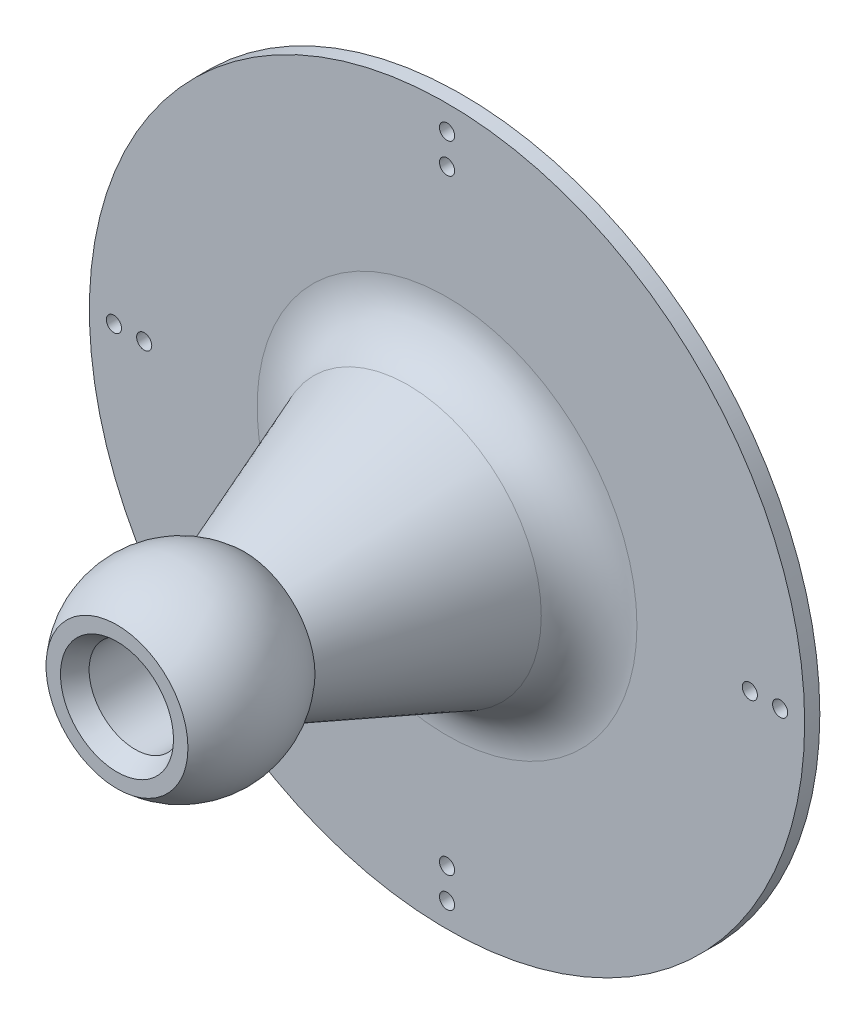
ISO-10303-21;
HEADER;
FILE_DESCRIPTION(('STEP AP214'),'2;1');
FILE_NAME('part.step','',(''),(''),'','','');
FILE_SCHEMA(('AUTOMOTIVE_DESIGN { 1 0 10303 214 1 1 1 1 }'));
ENDSEC;
DATA;
#1=APPLICATION_CONTEXT('core data for automotive mechanical design processes');
#2=APPLICATION_PROTOCOL_DEFINITION('international standard','automotive_design',2000,#1);
#3=PRODUCT_CONTEXT('',#1,'mechanical');
#4=PRODUCT('Part','Part','',(#3));
#5=PRODUCT_RELATED_PRODUCT_CATEGORY('part','',(#4));
#6=PRODUCT_DEFINITION_FORMATION('','',#4);
#7=PRODUCT_DEFINITION_CONTEXT('part definition',#1,'design');
#8=PRODUCT_DEFINITION('design','',#6,#7);
#9=PRODUCT_DEFINITION_SHAPE('','',#8);
#10=(LENGTH_UNIT() NAMED_UNIT(*) SI_UNIT(.MILLI.,.METRE.));
#11=(NAMED_UNIT(*) PLANE_ANGLE_UNIT() SI_UNIT($,.RADIAN.));
#12=(NAMED_UNIT(*) SI_UNIT($,.STERADIAN.) SOLID_ANGLE_UNIT());
#13=UNCERTAINTY_MEASURE_WITH_UNIT(LENGTH_MEASURE(1.E-05),#10,'distance_accuracy_value','');
#14=(GEOMETRIC_REPRESENTATION_CONTEXT(3) GLOBAL_UNCERTAINTY_ASSIGNED_CONTEXT((#13)) GLOBAL_UNIT_ASSIGNED_CONTEXT((#10,
#11,#12)) REPRESENTATION_CONTEXT('',''));
#15=CARTESIAN_POINT('',(0.,0.,0.));
#16=DIRECTION('',(0.,0.,1.));
#17=DIRECTION('',(1.,0.,0.));
#18=AXIS2_PLACEMENT_3D('',#15,#16,#17);
#19=CARTESIAN_POINT('',(0.,0.,-1.29374463449351));
#20=DIRECTION('',(0.,0.,1.));
#21=DIRECTION('',(1.,0.,0.));
#22=AXIS2_PLACEMENT_3D('',#19,#20,#21);
#23=CYLINDRICAL_SURFACE('',#22,75.);
#24=CARTESIAN_POINT('',(0.,0.,-1.29374463449352));
#25=DIRECTION('',(0.,0.,1.));
#26=DIRECTION('',(1.,0.,0.));
#27=AXIS2_PLACEMENT_3D('',#24,#25,#26);
#28=CIRCLE('',#27,75.);
#29=CARTESIAN_POINT('',(75.,0.,-1.29374463449351));
#30=VERTEX_POINT('',#29);
#31=EDGE_CURVE('E73',#30,#30,#28,.T.);
#32=ORIENTED_EDGE('',*,*,#31,.T.);
#33=EDGE_LOOP('',(#32));
#34=FACE_BOUND('',#33,.T.);
#35=CARTESIAN_POINT('',(0.,0.,1.88125536550682));
#36=DIRECTION('',(0.,0.,1.));
#37=DIRECTION('',(1.,0.,0.));
#38=AXIS2_PLACEMENT_3D('',#35,#36,#37);
#39=CIRCLE('',#38,75.);
#40=CARTESIAN_POINT('',(75.,0.,1.88125536550683));
#41=VERTEX_POINT('',#40);
#42=EDGE_CURVE('E61',#41,#41,#39,.T.);
#43=ORIENTED_EDGE('',*,*,#42,.F.);
#44=EDGE_LOOP('',(#43));
#45=FACE_BOUND('',#44,.T.);
#46=ADVANCED_FACE('F35',(#34,#45),#23,.T.);
#47=CARTESIAN_POINT('',(31.0649005738103,0.,1.88125536550682));
#48=DIRECTION('',(0.,0.,1.));
#49=DIRECTION('',(1.,0.,0.));
#50=AXIS2_PLACEMENT_3D('',#47,#48,#49);
#51=PLANE('',#50);
#52=CARTESIAN_POINT('',(0.,0.,1.88125536550682));
#53=DIRECTION('',(0.,0.,1.));
#54=DIRECTION('',(1.,0.,0.));
#55=AXIS2_PLACEMENT_3D('',#52,#53,#54);
#56=CIRCLE('',#55,39.8233826032935);
#57=CARTESIAN_POINT('',(39.8233826032935,0.,1.88125536550682));
#58=VERTEX_POINT('',#57);
#59=EDGE_CURVE('E10',#58,#58,#56,.F.);
#60=ORIENTED_EDGE('',*,*,#59,.T.);
#61=EDGE_LOOP('',(#60));
#62=FACE_BOUND('',#61,.T.);
#63=CARTESIAN_POINT('',(63.5,0.,1.88125536550683));
#64=DIRECTION('',(0.,0.,1.));
#65=DIRECTION('',(1.,0.,0.));
#66=AXIS2_PLACEMENT_3D('',#63,#64,#65);
#67=CIRCLE('',#66,1.58750000000001);
#68=CARTESIAN_POINT('',(65.0875,0.,1.88125536550683));
#69=VERTEX_POINT('',#68);
#70=EDGE_CURVE('E121',#69,#69,#67,.T.);
#71=ORIENTED_EDGE('',*,*,#70,.F.);
#72=EDGE_LOOP('',(#71));
#73=FACE_BOUND('',#72,.T.);
#74=CARTESIAN_POINT('',(69.85,0.,1.88125536550683));
#75=DIRECTION('',(0.,0.,1.));
#76=DIRECTION('',(1.,0.,0.));
#77=AXIS2_PLACEMENT_3D('',#74,#75,#76);
#78=CIRCLE('',#77,1.58750000000001);
#79=CARTESIAN_POINT('',(71.4375,0.,1.88125536550683));
#80=VERTEX_POINT('',#79);
#81=EDGE_CURVE('E115',#80,#80,#78,.T.);
#82=ORIENTED_EDGE('',*,*,#81,.F.);
#83=EDGE_LOOP('',(#82));
#84=FACE_BOUND('',#83,.T.);
#85=CARTESIAN_POINT('',(0.,63.5,1.88125536550682));
#86=DIRECTION('',(0.,0.,1.));
#87=DIRECTION('',(1.,0.,0.));
#88=AXIS2_PLACEMENT_3D('',#85,#86,#87);
#89=CIRCLE('',#88,1.58750000000001);
#90=CARTESIAN_POINT('',(1.5875,63.5,1.88125536550682));
#91=VERTEX_POINT('',#90);
#92=EDGE_CURVE('E109',#91,#91,#89,.T.);
#93=ORIENTED_EDGE('',*,*,#92,.F.);
#94=EDGE_LOOP('',(#93));
#95=FACE_BOUND('',#94,.T.);
#96=CARTESIAN_POINT('',(0.,69.85,1.88125536550682));
#97=DIRECTION('',(0.,0.,1.));
#98=DIRECTION('',(1.,0.,0.));
#99=AXIS2_PLACEMENT_3D('',#96,#97,#98);
#100=CIRCLE('',#99,1.58750000000001);
#101=CARTESIAN_POINT('',(1.5875,69.85,1.88125536550682));
#102=VERTEX_POINT('',#101);
#103=EDGE_CURVE('E103',#102,#102,#100,.T.);
#104=ORIENTED_EDGE('',*,*,#103,.F.);
#105=EDGE_LOOP('',(#104));
#106=FACE_BOUND('',#105,.T.);
#107=CARTESIAN_POINT('',(-63.5,0.,1.88125536550681));
#108=DIRECTION('',(0.,0.,1.));
#109=DIRECTION('',(1.,0.,0.));
#110=AXIS2_PLACEMENT_3D('',#107,#108,#109);
#111=CIRCLE('',#110,1.58750000000001);
#112=CARTESIAN_POINT('',(-61.9125,0.,1.88125536550681));
#113=VERTEX_POINT('',#112);
#114=EDGE_CURVE('E97',#113,#113,#111,.T.);
#115=ORIENTED_EDGE('',*,*,#114,.F.);
#116=EDGE_LOOP('',(#115));
#117=FACE_BOUND('',#116,.T.);
#118=CARTESIAN_POINT('',(-69.85,0.,1.88125536550681));
#119=DIRECTION('',(0.,0.,1.));
#120=DIRECTION('',(1.,0.,0.));
#121=AXIS2_PLACEMENT_3D('',#118,#119,#120);
#122=CIRCLE('',#121,1.58750000000001);
#123=CARTESIAN_POINT('',(-68.2625,0.,1.88125536550681));
#124=VERTEX_POINT('',#123);
#125=EDGE_CURVE('E91',#124,#124,#122,.T.);
#126=ORIENTED_EDGE('',*,*,#125,.F.);
#127=EDGE_LOOP('',(#126));
#128=FACE_BOUND('',#127,.T.);
#129=CARTESIAN_POINT('',(0.,-63.5,1.88125536550682));
#130=DIRECTION('',(0.,0.,1.));
#131=DIRECTION('',(1.,0.,0.));
#132=AXIS2_PLACEMENT_3D('',#129,#130,#131);
#133=CIRCLE('',#132,1.58750000000001);
#134=CARTESIAN_POINT('',(1.58750000000001,-63.5,1.88125536550682));
#135=VERTEX_POINT('',#134);
#136=EDGE_CURVE('E85',#135,#135,#133,.T.);
#137=ORIENTED_EDGE('',*,*,#136,.F.);
#138=EDGE_LOOP('',(#137));
#139=FACE_BOUND('',#138,.T.);
#140=CARTESIAN_POINT('',(0.,-69.85,1.88125536550682));
#141=DIRECTION('',(0.,0.,1.));
#142=DIRECTION('',(1.,0.,0.));
#143=AXIS2_PLACEMENT_3D('',#140,#141,#142);
#144=CIRCLE('',#143,1.58750000000001);
#145=CARTESIAN_POINT('',(1.58750000000001,-69.85,1.88125536550682));
#146=VERTEX_POINT('',#145);
#147=EDGE_CURVE('E79',#146,#146,#144,.T.);
#148=ORIENTED_EDGE('',*,*,#147,.F.);
#149=EDGE_LOOP('',(#148));
#150=FACE_BOUND('',#149,.T.);
#151=ORIENTED_EDGE('',*,*,#42,.T.);
#152=EDGE_LOOP('',(#151));
#153=FACE_BOUND('',#152,.T.);
#154=ADVANCED_FACE('F155',(#62,#73,#84,#95,#106,#117,#128,#139,#150,#153),#51,.T.);
#155=CARTESIAN_POINT('',(0.,0.,44.45));
#156=DIRECTION('',(0.,0.,-1.));
#157=DIRECTION('',(-1.,0.,0.));
#158=AXIS2_PLACEMENT_3D('',#155,#156,#157);
#159=CONICAL_SURFACE('',#158,14.8807171904986,0.363312458048292);
#160=CARTESIAN_POINT('',(0.,0.,10.0680257085899));
#161=DIRECTION('',(0.,0.,-1.));
#162=DIRECTION('',(-1.,0.,0.));
#163=AXIS2_PLACEMENT_3D('',#160,#161,#162);
#164=CIRCLE('',#163,27.9523776726262);
#165=CARTESIAN_POINT('',(-27.9523776726262,0.,10.0680257085899));
#166=VERTEX_POINT('',#165);
#167=EDGE_CURVE('E42',#166,#166,#164,.F.);
#168=ORIENTED_EDGE('',*,*,#167,.T.);
#169=EDGE_LOOP('',(#168));
#170=FACE_BOUND('',#169,.T.);
#171=CARTESIAN_POINT('',(0.,0.,44.45));
#172=DIRECTION('',(0.,0.,1.));
#173=DIRECTION('',(1.,0.,0.));
#174=AXIS2_PLACEMENT_3D('',#171,#172,#173);
#175=CIRCLE('',#174,14.8807171904986);
#176=CARTESIAN_POINT('',(14.8807171904986,0.,44.45));
#177=VERTEX_POINT('',#176);
#178=EDGE_CURVE('E64',#177,#177,#175,.T.);
#179=ORIENTED_EDGE('',*,*,#178,.F.);
#180=EDGE_LOOP('',(#179));
#181=FACE_BOUND('',#180,.T.);
#182=ADVANCED_FACE('F160',(#170,#181),#159,.T.);
#183=CARTESIAN_POINT('',(-1.50747470062384E-12,0.,57.768975615972));
#184=DIRECTION('',(0.,0.,1.));
#185=DIRECTION('',(1.,0.,0.));
#186=AXIS2_PLACEMENT_3D('',#183,#184,#185);
#187=SPHERICAL_SURFACE('',#186,19.9707500000001);
#188=CARTESIAN_POINT('',(0.,0.,71.0879512319442));
#189=DIRECTION('',(0.,0.,1.));
#190=DIRECTION('',(1.,0.,0.));
#191=AXIS2_PLACEMENT_3D('',#188,#189,#190);
#192=CIRCLE('',#191,14.8807171904985);
#193=CARTESIAN_POINT('',(14.8807171904984,0.,71.0879512319442));
#194=VERTEX_POINT('',#193);
#195=EDGE_CURVE('E67',#194,#194,#192,.T.);
#196=CARTESIAN_POINT('',(14.8807171904986,0.,44.45));
#197=CARTESIAN_POINT('',(15.083300924023,0.,44.6763303094797));
#198=CARTESIAN_POINT('',(15.2807130555634,0.,44.9072889083303));
#199=CARTESIAN_POINT('',(15.6648007895345,0.,45.3779675146893));
#200=CARTESIAN_POINT('',(15.8514763919652,0.,45.6176875221975));
#201=CARTESIAN_POINT('',(16.2136977425753,0.,46.105393775787));
#202=CARTESIAN_POINT('',(16.3892434907546,0.,46.3533800218682));
#203=CARTESIAN_POINT('',(16.7288409654187,0.,46.8571014877006));
#204=CARTESIAN_POINT('',(16.8928926919034,0.,47.1128367074517));
#205=CARTESIAN_POINT('',(17.2091602781304,0.,47.6315240341799));
#206=CARTESIAN_POINT('',(17.3613761378726,0.,47.8944761411569));
#207=CARTESIAN_POINT('',(17.6536552142219,0.,48.4270497816502));
#208=CARTESIAN_POINT('',(17.7937184308291,0.,48.6966713151666));
#209=CARTESIAN_POINT('',(18.0614006274231,0.,49.2420225583447));
#210=CARTESIAN_POINT('',(18.18901960741,0.,49.5177522680065));
#211=CARTESIAN_POINT('',(18.4315476732751,0.,50.0747458725197));
#212=CARTESIAN_POINT('',(18.5464567591533,0.,50.3560097673712));
#213=CARTESIAN_POINT('',(18.763325829186,0.,50.9234862375631));
#214=CARTESIAN_POINT('',(18.8652858133404,0.,51.2096988129035));
#215=CARTESIAN_POINT('',(19.0560444306293,0.,51.7864768359117));
#216=CARTESIAN_POINT('',(19.1448430637638,0.,52.0770422835796));
#217=CARTESIAN_POINT('',(19.3090941270641,0.,52.6619211822061));
#218=CARTESIAN_POINT('',(19.3845465572298,0.,52.9562346331646));
#219=CARTESIAN_POINT('',(19.5219481455499,0.,53.5479968669995));
#220=CARTESIAN_POINT('',(19.5838973037041,0.,53.8454456498759));
#221=CARTESIAN_POINT('',(19.6941633886329,0.,54.4428593493982));
#222=CARTESIAN_POINT('',(19.7424803154073,0.,54.7428242660442));
#223=CARTESIAN_POINT('',(19.8253813563909,0.,55.3446457971208));
#224=CARTESIAN_POINT('',(19.8599654706,0.,55.6465024115515));
#225=CARTESIAN_POINT('',(19.9153288928151,0.,56.2514789642739));
#226=CARTESIAN_POINT('',(19.9361082008211,0.,56.5545989025656));
#227=CARTESIAN_POINT('',(19.9638187544128,0.,57.161471099229));
#228=CARTESIAN_POINT('',(19.9707499999985,0.,57.4652233576006));
#229=CARTESIAN_POINT('',(19.9707499999985,0.,58.0727278743437));
#230=CARTESIAN_POINT('',(19.9638187544128,0.,58.3764801327153));
#231=CARTESIAN_POINT('',(19.936108200821,0.,58.9833523293786));
#232=CARTESIAN_POINT('',(19.915328892815,0.,59.2864722676703));
#233=CARTESIAN_POINT('',(19.8599654705999,0.,59.8914488203928));
#234=CARTESIAN_POINT('',(19.8253813563908,0.,60.1933054348234));
#235=CARTESIAN_POINT('',(19.7424803154073,0.,60.7951269659));
#236=CARTESIAN_POINT('',(19.6941633886328,0.,61.095091882546));
#237=CARTESIAN_POINT('',(19.5838973037041,0.,61.6925055820683));
#238=CARTESIAN_POINT('',(19.5219481455498,0.,61.9899543649447));
#239=CARTESIAN_POINT('',(19.3845465572298,0.,62.5817165987796));
#240=CARTESIAN_POINT('',(19.309094127064,0.,62.8760300497382));
#241=CARTESIAN_POINT('',(19.1448430637638,0.,63.4609089483646));
#242=CARTESIAN_POINT('',(19.0560444306293,0.,63.7514743960325));
#243=CARTESIAN_POINT('',(18.8652858133403,0.,64.3282524190408));
#244=CARTESIAN_POINT('',(18.7633258291859,0.,64.6144649943811));
#245=CARTESIAN_POINT('',(18.5464567591532,0.,65.181941464573));
#246=CARTESIAN_POINT('',(18.431547673275,0.,65.4632053594245));
#247=CARTESIAN_POINT('',(18.1890196074099,0.,66.0201989639377));
#248=CARTESIAN_POINT('',(18.061400627423,0.,66.2959286735995));
#249=CARTESIAN_POINT('',(17.793718430829,0.,66.8412799167776));
#250=CARTESIAN_POINT('',(17.6536552142218,0.,67.110901450294));
#251=CARTESIAN_POINT('',(17.3613761378724,0.,67.6434750907873));
#252=CARTESIAN_POINT('',(17.2091602781303,0.,67.9064271977643));
#253=CARTESIAN_POINT('',(16.8928926919033,0.,68.4251145244925));
#254=CARTESIAN_POINT('',(16.7288409654186,0.,68.6808497442436));
#255=CARTESIAN_POINT('',(16.3892434907545,0.,69.184571210076));
#256=CARTESIAN_POINT('',(16.2136977425751,0.,69.4325574561572));
#257=CARTESIAN_POINT('',(15.8514763919651,0.,69.9202637097467));
#258=CARTESIAN_POINT('',(15.6648007895344,0.,70.1599837172549));
#259=CARTESIAN_POINT('',(15.2807130555632,0.,70.6306623236138));
#260=CARTESIAN_POINT('',(15.0833009240228,0.,70.8616209224645));
#261=CARTESIAN_POINT('',(14.8807171904984,0.,71.0879512319442));
#262=B_SPLINE_CURVE_WITH_KNOTS('',3,(#196,#197,#198,#199,#200,#201,#202,#203,#204,#205,#206,
#207,#208,#209,#210,#211,#212,#213,#214,#215,#216,#217,#218,#219,#220,#221,#222,#223,#224,#225,
#226,#227,#228,#229,#230,#231,#232,#233,#234,#235,#236,#237,#238,#239,#240,#241,#242,#243,#244,
#245,#246,#247,#248,#249,#250,#251,#252,#253,#254,#255,#256,#257,#258,#259,#260,#261),
.UNSPECIFIED.,.F.,.F.,(4,2,2,2,2,2,2,2,2,2,2,2,2,2,2,2,2,2,2,2,2,2,2,2,2,2,2,2,2,2,2,2,4),(0.,
0.911177745396351,1.8223554907927,2.73353323618905,3.6447109815854,4.55588872698175,
5.4670664723781,6.37824421777446,7.28942196317081,8.20059970856716,9.11177745396351,
10.0229551993599,10.9341329447562,11.8453106901526,12.7564884355489,13.6676661809453,
14.5788439263416,15.490021671738,16.4011994171343,17.3123771625307,18.223554907927,
19.1347326533234,20.0459103987197,20.9570881441161,21.8682658895124,22.7794436349088,
23.6906213803051,24.6017991257015,25.5129768710978,26.4241546164942,27.3353323618905,
28.2465101072869,29.1576878526832),.UNSPECIFIED.);
#263=EDGE_CURVE('BSEAM165',#177,#194,#262,.T.);
#264=ORIENTED_EDGE('',*,*,#178,.T.);
#265=ORIENTED_EDGE('',*,*,#195,.F.);
#266=ORIENTED_EDGE('',*,*,#263,.T.);
#267=ORIENTED_EDGE('',*,*,#263,.F.);
#268=EDGE_LOOP('',(#264,#266,#265,#267));
#269=FACE_BOUND('',#268,.T.);
#270=ADVANCED_FACE('F165',(#269),#187,.T.);
#271=CARTESIAN_POINT('',(9.65199999999867,0.,71.0879512319442));
#272=DIRECTION('',(0.,0.,1.));
#273=DIRECTION('',(1.,0.,0.));
#274=AXIS2_PLACEMENT_3D('',#271,#272,#273);
#275=PLANE('',#274);
#276=CARTESIAN_POINT('',(0.,0.,71.0879512319442));
#277=DIRECTION('',(0.,0.,1.));
#278=DIRECTION('',(1.,0.,0.));
#279=AXIS2_PLACEMENT_3D('',#276,#277,#278);
#280=CIRCLE('',#279,11.8517045256111);
#281=CARTESIAN_POINT('',(11.8517045256111,0.,71.0879512319442));
#282=VERTEX_POINT('',#281);
#283=EDGE_CURVE('E55',#282,#282,#280,.F.);
#284=ORIENTED_EDGE('',*,*,#283,.T.);
#285=EDGE_LOOP('',(#284));
#286=FACE_BOUND('',#285,.T.);
#287=ORIENTED_EDGE('',*,*,#195,.T.);
#288=EDGE_LOOP('',(#287));
#289=FACE_BOUND('',#288,.T.);
#290=ADVANCED_FACE('F197',(#286,#289),#275,.T.);
#291=CARTESIAN_POINT('',(0.,0.,-1.29374463449351));
#292=DIRECTION('',(0.,0.,1.));
#293=DIRECTION('',(1.,0.,0.));
#294=AXIS2_PLACEMENT_3D('',#291,#292,#293);
#295=CYLINDRICAL_SURFACE('',#294,9.65199999999866);
#296=CARTESIAN_POINT('',(0.,0.,67.2779512319443));
#297=DIRECTION('',(0.,0.,1.));
#298=DIRECTION('',(1.,0.,0.));
#299=AXIS2_PLACEMENT_3D('',#296,#297,#298);
#300=CIRCLE('',#299,9.65199999999866);
#301=CARTESIAN_POINT('',(9.65199999999865,0.,67.2779512319443));
#302=VERTEX_POINT('',#301);
#303=EDGE_CURVE('E58',#302,#302,#300,.T.);
#304=ORIENTED_EDGE('',*,*,#303,.T.);
#305=EDGE_LOOP('',(#304));
#306=FACE_BOUND('',#305,.T.);
#307=CARTESIAN_POINT('',(0.,0.,22.7279363428212));
#308=DIRECTION('',(0.,0.,1.));
#309=DIRECTION('',(1.,0.,0.));
#310=AXIS2_PLACEMENT_3D('',#307,#308,#309);
#311=CIRCLE('',#310,9.65199999999864);
#312=CARTESIAN_POINT('',(9.65199999999863,0.,22.7279363428212));
#313=VERTEX_POINT('',#312);
#314=EDGE_CURVE('E70',#313,#313,#311,.T.);
#315=ORIENTED_EDGE('',*,*,#314,.F.);
#316=EDGE_LOOP('',(#315));
#317=FACE_BOUND('',#316,.T.);
#318=ADVANCED_FACE('F191',(#306,#317),#295,.F.);
#319=CARTESIAN_POINT('',(0.,0.,5.02040121775));
#320=DIRECTION('',(0.,0.,1.));
#321=DIRECTION('',(1.,0.,0.));
#322=AXIS2_PLACEMENT_3D('',#319,#320,#321);
#323=SPHERICAL_SURFACE('',#322,20.1672483052499);
#324=CARTESIAN_POINT('',(0.,0.,2.60685252921898));
#325=DIRECTION('',(0.,0.,1.));
#326=DIRECTION('',(1.,0.,0.));
#327=AXIS2_PLACEMENT_3D('',#324,#325,#326);
#328=CIRCLE('',#327,20.0223047358113);
#329=CARTESIAN_POINT('',(20.0223047358114,0.,2.60685252921899));
#330=VERTEX_POINT('',#329);
#331=EDGE_CURVE('E76',#330,#330,#328,.F.);
#332=CARTESIAN_POINT('',(9.65199999999863,0.,22.7279363428212));
#333=CARTESIAN_POINT('',(9.8718150562456,0.,22.6081224828854));
#334=CARTESIAN_POINT('',(10.0893967846654,0.,22.484211678121));
#335=CARTESIAN_POINT('',(10.5197970719614,0.,22.2283767714048));
#336=CARTESIAN_POINT('',(10.7326156308377,0.,22.0964526694531));
#337=CARTESIAN_POINT('',(11.1531930651572,0.,21.8247717608323));
#338=CARTESIAN_POINT('',(11.3609519406006,0.,21.6850149541632));
#339=CARTESIAN_POINT('',(11.7711222803323,0.,21.3978630677716));
#340=CARTESIAN_POINT('',(11.9735337446206,0.,21.250467988049));
#341=CARTESIAN_POINT('',(12.3727284754114,0.,20.9482437814837));
#342=CARTESIAN_POINT('',(12.5695117419138,0.,20.793414654641));
#343=CARTESIAN_POINT('',(12.9571772222608,0.,20.4765371024256));
#344=CARTESIAN_POINT('',(13.1480594361053,0.,20.314488677053));
#345=CARTESIAN_POINT('',(13.5236581052768,0.,19.9833972301756));
#346=CARTESIAN_POINT('',(13.7083745606039,0.,19.8143542086707));
#347=CARTESIAN_POINT('',(14.071385566136,0.,19.4695079867657));
#348=CARTESIAN_POINT('',(14.249680116341,0.,19.2937047863654));
#349=CARTESIAN_POINT('',(14.5996000679128,0.,18.935581994215));
#350=CARTESIAN_POINT('',(14.7712254692796,0.,18.7532624024649));
#351=CARTESIAN_POINT('',(15.107569128303,0.,18.3823596526208));
#352=CARTESIAN_POINT('',(15.2722873859596,0.,18.1937764945268));
#353=CARTESIAN_POINT('',(15.5945883407342,0.,17.8106081224685));
#354=CARTESIAN_POINT('',(15.7521710378523,0.,17.6160229085041));
#355=CARTESIAN_POINT('',(16.0599823497366,0.,17.2211202583808));
#356=CARTESIAN_POINT('',(16.2102109645027,0.,17.0208028222218));
#357=CARTESIAN_POINT('',(16.5031057878514,0.,16.6147135103054));
#358=CARTESIAN_POINT('',(16.645771996434,0.,16.408941634548));
#359=CARTESIAN_POINT('',(16.9233441704671,0.,15.9922287897736));
#360=CARTESIAN_POINT('',(17.0582501359177,0.,15.7812878207566));
#361=CARTESIAN_POINT('',(17.3201147479601,0.,15.3545293038441));
#362=CARTESIAN_POINT('',(17.4470733945519,0.,15.1387117559487));
#363=CARTESIAN_POINT('',(17.6928673137929,0.,14.7024993580717));
#364=CARTESIAN_POINT('',(17.8117025864422,0.,14.4821045080902));
#365=CARTESIAN_POINT('',(18.0410849674946,0.,14.037043130233));
#366=CARTESIAN_POINT('',(18.1516320758978,0.,13.8123766023573));
#367=CARTESIAN_POINT('',(18.3642848314521,0.,13.3590834164912));
#368=CARTESIAN_POINT('',(18.4663904786031,0.,13.1304567585008));
#369=CARTESIAN_POINT('',(18.6620187205225,0.,12.6695603517444));
#370=CARTESIAN_POINT('',(18.755541315291,0.,12.4372906029785));
#371=CARTESIAN_POINT('',(18.9338737635374,0.,11.9694301059284));
#372=CARTESIAN_POINT('',(19.0186836170154,0.,11.7338393576443));
#373=CARTESIAN_POINT('',(19.1794729758346,0.,11.259663558085));
#374=CARTESIAN_POINT('',(19.2554524811759,0.,11.0210785068099));
#375=CARTESIAN_POINT('',(19.3984757820319,0.,10.5412449500315));
#376=CARTESIAN_POINT('',(19.4655195775467,0.,10.2999964445283));
#377=CARTESIAN_POINT('',(19.5905784882919,0.,9.81517052150259));
#378=CARTESIAN_POINT('',(19.6485936035224,0.,9.57159310398012));
#379=CARTESIAN_POINT('',(19.7555147035127,0.,9.08244712864756));
#380=CARTESIAN_POINT('',(19.8044206882724,0.,8.83687857083748));
#381=CARTESIAN_POINT('',(19.8930557085332,0.,8.3440908478279));
#382=CARTESIAN_POINT('',(19.9327847440343,0.,8.09687168262842));
#383=CARTESIAN_POINT('',(20.0030107740535,0.,7.60112556654947));
#384=CARTESIAN_POINT('',(20.0335077685716,0.,7.35259861567001));
#385=CARTESIAN_POINT('',(20.0852274223151,0.,6.85458156385802));
#386=CARTESIAN_POINT('',(20.1064500815404,0.,6.60509146292549));
#387=CARTESIAN_POINT('',(20.139591649015,0.,6.10549408077068));
#388=CARTESIAN_POINT('',(20.1515105572642,0.,5.85538679954841));
#389=CARTESIAN_POINT('',(20.1660280423185,0.,5.35490188793483));
#390=CARTESIAN_POINT('',(20.1686266191237,0.,5.10452425754353));
#391=CARTESIAN_POINT('',(20.1645000332757,0.,4.60384583306019));
#392=CARTESIAN_POINT('',(20.1577748706226,0.,4.35354503896815));
#393=CARTESIAN_POINT('',(20.1350094022422,0.,3.85336744269131));
#394=CARTESIAN_POINT('',(20.118969096515,0.,3.6034906405065));
#395=CARTESIAN_POINT('',(20.0775983077276,0.,3.10450730948823));
#396=CARTESIAN_POINT('',(20.0522678246674,0.,2.85540078065475));
#397=CARTESIAN_POINT('',(20.0223047358114,0.,2.60685252921899));
#398=B_SPLINE_CURVE_WITH_KNOTS('',3,(#332,#333,#334,#335,#336,#337,#338,#339,#340,#341,#342,
#343,#344,#345,#346,#347,#348,#349,#350,#351,#352,#353,#354,#355,#356,#357,#358,#359,#360,#361,
#362,#363,#364,#365,#366,#367,#368,#369,#370,#371,#372,#373,#374,#375,#376,#377,#378,#379,#380,
#381,#382,#383,#384,#385,#386,#387,#388,#389,#390,#391,#392,#393,#394,#395,#396,#397),
.UNSPECIFIED.,.F.,.F.,(4,2,2,2,2,2,2,2,2,2,2,2,2,2,2,2,2,2,2,2,2,2,2,2,2,2,2,2,2,2,2,2,4),(0.,
0.750999743515791,1.50199948703159,2.25299923054738,3.00399897406317,3.75499871757896,
4.50599846109475,5.25699820461055,6.00799794812634,6.75899769164213,7.50999743515793,
8.26099717867372,9.01199692218951,9.7629966657053,10.5139964092211,11.2649961527369,
12.0159958962527,12.7669956397685,13.5179953832843,14.2689951268001,15.0199948703158,
15.7709946138316,16.5219943573474,17.2729941008632,18.023993844379,18.7749935878948,
19.5259933314106,20.2769930749264,21.0279928184422,21.778992561958,22.5299923054738,
23.2809920489896,24.0319917925054),.UNSPECIFIED.);
#399=EDGE_CURVE('BSEAM134',#313,#330,#398,.T.);
#400=ORIENTED_EDGE('',*,*,#314,.T.);
#401=ORIENTED_EDGE('',*,*,#331,.T.);
#402=ORIENTED_EDGE('',*,*,#399,.T.);
#403=ORIENTED_EDGE('',*,*,#399,.F.);
#404=EDGE_LOOP('',(#400,#402,#401,#403));
#405=FACE_BOUND('',#404,.T.);
#406=ADVANCED_FACE('F134',(#405),#323,.F.);
#407=CARTESIAN_POINT('',(75.,0.,-1.29374463449351));
#408=DIRECTION('',(0.,0.,-1.));
#409=DIRECTION('',(-1.,0.,0.));
#410=AXIS2_PLACEMENT_3D('',#407,#408,#409);
#411=PLANE('',#410);
#412=CARTESIAN_POINT('',(0.,0.,-1.29374463449352));
#413=DIRECTION('',(0.,0.,-1.));
#414=DIRECTION('',(-1.,0.,0.));
#415=AXIS2_PLACEMENT_3D('',#412,#413,#414);
#416=CIRCLE('',#415,31.3050417818289);
#417=CARTESIAN_POINT('',(-31.3050417818289,0.,-1.29374463449352));
#418=VERTEX_POINT('',#417);
#419=EDGE_CURVE('E46',#418,#418,#416,.F.);
#420=ORIENTED_EDGE('',*,*,#419,.T.);
#421=EDGE_LOOP('',(#420));
#422=FACE_BOUND('',#421,.T.);
#423=CARTESIAN_POINT('',(63.5,0.,-1.29374463449351));
#424=DIRECTION('',(0.,0.,-1.));
#425=DIRECTION('',(-1.,0.,0.));
#426=AXIS2_PLACEMENT_3D('',#423,#424,#425);
#427=CIRCLE('',#426,1.58750000000002);
#428=CARTESIAN_POINT('',(61.9125,0.,-1.29374463449351));
#429=VERTEX_POINT('',#428);
#430=EDGE_CURVE('E124',#429,#429,#427,.T.);
#431=ORIENTED_EDGE('',*,*,#430,.F.);
#432=EDGE_LOOP('',(#431));
#433=FACE_BOUND('',#432,.T.);
#434=CARTESIAN_POINT('',(69.85,0.,-1.29374463449351));
#435=DIRECTION('',(0.,0.,-1.));
#436=DIRECTION('',(-1.,0.,0.));
#437=AXIS2_PLACEMENT_3D('',#434,#435,#436);
#438=CIRCLE('',#437,1.58750000000002);
#439=CARTESIAN_POINT('',(68.2625,0.,-1.29374463449351));
#440=VERTEX_POINT('',#439);
#441=EDGE_CURVE('E118',#440,#440,#438,.T.);
#442=ORIENTED_EDGE('',*,*,#441,.F.);
#443=EDGE_LOOP('',(#442));
#444=FACE_BOUND('',#443,.T.);
#445=CARTESIAN_POINT('',(0.,63.5,-1.29374463449352));
#446=DIRECTION('',(0.,0.,-1.));
#447=DIRECTION('',(-1.,0.,0.));
#448=AXIS2_PLACEMENT_3D('',#445,#446,#447);
#449=CIRCLE('',#448,1.58750000000001);
#450=CARTESIAN_POINT('',(-1.58750000000002,63.5,-1.29374463449352));
#451=VERTEX_POINT('',#450);
#452=EDGE_CURVE('E112',#451,#451,#449,.T.);
#453=ORIENTED_EDGE('',*,*,#452,.F.);
#454=EDGE_LOOP('',(#453));
#455=FACE_BOUND('',#454,.T.);
#456=CARTESIAN_POINT('',(0.,69.85,-1.29374463449352));
#457=DIRECTION('',(0.,0.,-1.));
#458=DIRECTION('',(-1.,0.,0.));
#459=AXIS2_PLACEMENT_3D('',#456,#457,#458);
#460=CIRCLE('',#459,1.58750000000001);
#461=CARTESIAN_POINT('',(-1.58750000000002,69.85,-1.29374463449352));
#462=VERTEX_POINT('',#461);
#463=EDGE_CURVE('E106',#462,#462,#460,.T.);
#464=ORIENTED_EDGE('',*,*,#463,.F.);
#465=EDGE_LOOP('',(#464));
#466=FACE_BOUND('',#465,.T.);
#467=CARTESIAN_POINT('',(-63.5,0.,-1.29374463449353));
#468=DIRECTION('',(0.,0.,-1.));
#469=DIRECTION('',(-1.,0.,0.));
#470=AXIS2_PLACEMENT_3D('',#467,#468,#469);
#471=CIRCLE('',#470,1.58750000000001);
#472=CARTESIAN_POINT('',(-65.0875,0.,-1.29374463449353));
#473=VERTEX_POINT('',#472);
#474=EDGE_CURVE('E100',#473,#473,#471,.T.);
#475=ORIENTED_EDGE('',*,*,#474,.F.);
#476=EDGE_LOOP('',(#475));
#477=FACE_BOUND('',#476,.T.);
#478=CARTESIAN_POINT('',(-69.85,0.,-1.29374463449353));
#479=DIRECTION('',(0.,0.,-1.));
#480=DIRECTION('',(-1.,0.,0.));
#481=AXIS2_PLACEMENT_3D('',#478,#479,#480);
#482=CIRCLE('',#481,1.58750000000002);
#483=CARTESIAN_POINT('',(-71.4375,0.,-1.29374463449353));
#484=VERTEX_POINT('',#483);
#485=EDGE_CURVE('E94',#484,#484,#482,.T.);
#486=ORIENTED_EDGE('',*,*,#485,.F.);
#487=EDGE_LOOP('',(#486));
#488=FACE_BOUND('',#487,.T.);
#489=CARTESIAN_POINT('',(0.,-63.5,-1.29374463449352));
#490=DIRECTION('',(0.,0.,-1.));
#491=DIRECTION('',(-1.,0.,0.));
#492=AXIS2_PLACEMENT_3D('',#489,#490,#491);
#493=CIRCLE('',#492,1.58750000000001);
#494=CARTESIAN_POINT('',(-1.58750000000001,-63.5,-1.29374463449352));
#495=VERTEX_POINT('',#494);
#496=EDGE_CURVE('E88',#495,#495,#493,.T.);
#497=ORIENTED_EDGE('',*,*,#496,.F.);
#498=EDGE_LOOP('',(#497));
#499=FACE_BOUND('',#498,.T.);
#500=CARTESIAN_POINT('',(0.,-69.85,-1.29374463449352));
#501=DIRECTION('',(0.,0.,-1.));
#502=DIRECTION('',(-1.,0.,0.));
#503=AXIS2_PLACEMENT_3D('',#500,#501,#502);
#504=CIRCLE('',#503,1.58750000000001);
#505=CARTESIAN_POINT('',(-1.58750000000001,-69.85,-1.29374463449352));
#506=VERTEX_POINT('',#505);
#507=EDGE_CURVE('E82',#506,#506,#504,.T.);
#508=ORIENTED_EDGE('',*,*,#507,.F.);
#509=EDGE_LOOP('',(#508));
#510=FACE_BOUND('',#509,.T.);
#511=ORIENTED_EDGE('',*,*,#31,.F.);
#512=EDGE_LOOP('',(#511));
#513=FACE_BOUND('',#512,.T.);
#514=ADVANCED_FACE('F130',(#422,#433,#444,#455,#466,#477,#488,#499,#510,#513),#411,.T.);
#515=CARTESIAN_POINT('',(0.,0.,-1.29374463449352));
#516=DIRECTION('',(0.,0.,-1.));
#517=DIRECTION('',(1.,0.,0.));
#518=AXIS2_PLACEMENT_3D('',#515,#516,#517);
#519=CONICAL_SURFACE('',#518,28.5334933519968,1.14106941877358);
#520=CARTESIAN_POINT('',(0.,0.,-0.139055044598428));
#521=DIRECTION('',(0.,0.,-1.));
#522=DIRECTION('',(-1.,0.,0.));
#523=AXIS2_PLACEMENT_3D('',#520,#521,#522);
#524=CIRCLE('',#523,26.0139353252999);
#525=CARTESIAN_POINT('',(-26.0139353252999,0.,-0.139055044598431));
#526=VERTEX_POINT('',#525);
#527=EDGE_CURVE('E50',#526,#526,#524,.T.);
#528=ORIENTED_EDGE('',*,*,#527,.T.);
#529=EDGE_LOOP('',(#528));
#530=FACE_BOUND('',#529,.T.);
#531=ORIENTED_EDGE('',*,*,#331,.F.);
#532=EDGE_LOOP('',(#531));
#533=FACE_BOUND('',#532,.T.);
#534=ADVANCED_FACE('F133',(#530,#533),#519,.F.);
#535=CARTESIAN_POINT('',(0.,-69.85,-1.29374463449352));
#536=DIRECTION('',(0.,0.,-1.));
#537=DIRECTION('',(-1.,0.,0.));
#538=AXIS2_PLACEMENT_3D('',#535,#536,#537);
#539=CYLINDRICAL_SURFACE('',#538,1.58750000000001);
#540=ORIENTED_EDGE('',*,*,#147,.T.);
#541=EDGE_LOOP('',(#540));
#542=FACE_BOUND('',#541,.T.);
#543=ORIENTED_EDGE('',*,*,#507,.T.);
#544=EDGE_LOOP('',(#543));
#545=FACE_BOUND('',#544,.T.);
#546=ADVANCED_FACE('F186',(#542,#545),#539,.F.);
#547=CARTESIAN_POINT('',(0.,-63.5,-1.29374463449352));
#548=DIRECTION('',(0.,0.,-1.));
#549=DIRECTION('',(-1.,0.,0.));
#550=AXIS2_PLACEMENT_3D('',#547,#548,#549);
#551=CYLINDRICAL_SURFACE('',#550,1.58750000000001);
#552=ORIENTED_EDGE('',*,*,#136,.T.);
#553=EDGE_LOOP('',(#552));
#554=FACE_BOUND('',#553,.T.);
#555=ORIENTED_EDGE('',*,*,#496,.T.);
#556=EDGE_LOOP('',(#555));
#557=FACE_BOUND('',#556,.T.);
#558=ADVANCED_FACE('F273',(#554,#557),#551,.F.);
#559=CARTESIAN_POINT('',(-69.85,0.,-1.29374463449353));
#560=DIRECTION('',(0.,0.,-1.));
#561=DIRECTION('',(-1.,0.,0.));
#562=AXIS2_PLACEMENT_3D('',#559,#560,#561);
#563=CYLINDRICAL_SURFACE('',#562,1.58750000000001);
#564=ORIENTED_EDGE('',*,*,#125,.T.);
#565=EDGE_LOOP('',(#564));
#566=FACE_BOUND('',#565,.T.);
#567=ORIENTED_EDGE('',*,*,#485,.T.);
#568=EDGE_LOOP('',(#567));
#569=FACE_BOUND('',#568,.T.);
#570=ADVANCED_FACE('F280',(#566,#569),#563,.F.);
#571=CARTESIAN_POINT('',(-63.5,0.,-1.29374463449353));
#572=DIRECTION('',(0.,0.,-1.));
#573=DIRECTION('',(-1.,0.,0.));
#574=AXIS2_PLACEMENT_3D('',#571,#572,#573);
#575=CYLINDRICAL_SURFACE('',#574,1.58750000000001);
#576=ORIENTED_EDGE('',*,*,#114,.T.);
#577=EDGE_LOOP('',(#576));
#578=FACE_BOUND('',#577,.T.);
#579=ORIENTED_EDGE('',*,*,#474,.T.);
#580=EDGE_LOOP('',(#579));
#581=FACE_BOUND('',#580,.T.);
#582=ADVANCED_FACE('F288',(#578,#581),#575,.F.);
#583=CARTESIAN_POINT('',(0.,69.85,-1.29374463449352));
#584=DIRECTION('',(0.,0.,-1.));
#585=DIRECTION('',(-1.,0.,0.));
#586=AXIS2_PLACEMENT_3D('',#583,#584,#585);
#587=CYLINDRICAL_SURFACE('',#586,1.58750000000001);
#588=ORIENTED_EDGE('',*,*,#103,.T.);
#589=EDGE_LOOP('',(#588));
#590=FACE_BOUND('',#589,.T.);
#591=ORIENTED_EDGE('',*,*,#463,.T.);
#592=EDGE_LOOP('',(#591));
#593=FACE_BOUND('',#592,.T.);
#594=ADVANCED_FACE('F296',(#590,#593),#587,.F.);
#595=CARTESIAN_POINT('',(0.,63.5,-1.29374463449352));
#596=DIRECTION('',(0.,0.,-1.));
#597=DIRECTION('',(-1.,0.,0.));
#598=AXIS2_PLACEMENT_3D('',#595,#596,#597);
#599=CYLINDRICAL_SURFACE('',#598,1.58750000000001);
#600=ORIENTED_EDGE('',*,*,#92,.T.);
#601=EDGE_LOOP('',(#600));
#602=FACE_BOUND('',#601,.T.);
#603=ORIENTED_EDGE('',*,*,#452,.T.);
#604=EDGE_LOOP('',(#603));
#605=FACE_BOUND('',#604,.T.);
#606=ADVANCED_FACE('F304',(#602,#605),#599,.F.);
#607=CARTESIAN_POINT('',(69.85,0.,-1.29374463449351));
#608=DIRECTION('',(0.,0.,-1.));
#609=DIRECTION('',(-1.,0.,0.));
#610=AXIS2_PLACEMENT_3D('',#607,#608,#609);
#611=CYLINDRICAL_SURFACE('',#610,1.58750000000001);
#612=ORIENTED_EDGE('',*,*,#81,.T.);
#613=EDGE_LOOP('',(#612));
#614=FACE_BOUND('',#613,.T.);
#615=ORIENTED_EDGE('',*,*,#441,.T.);
#616=EDGE_LOOP('',(#615));
#617=FACE_BOUND('',#616,.T.);
#618=ADVANCED_FACE('F312',(#614,#617),#611,.F.);
#619=CARTESIAN_POINT('',(63.5,0.,-1.29374463449351));
#620=DIRECTION('',(0.,0.,-1.));
#621=DIRECTION('',(-1.,0.,0.));
#622=AXIS2_PLACEMENT_3D('',#619,#620,#621);
#623=CYLINDRICAL_SURFACE('',#622,1.58750000000001);
#624=ORIENTED_EDGE('',*,*,#70,.T.);
#625=EDGE_LOOP('',(#624));
#626=FACE_BOUND('',#625,.T.);
#627=ORIENTED_EDGE('',*,*,#430,.T.);
#628=EDGE_LOOP('',(#627));
#629=FACE_BOUND('',#628,.T.);
#630=ADVANCED_FACE('F128',(#626,#629),#623,.F.);
#631=CARTESIAN_POINT('',(0.,0.,67.2779512319443));
#632=DIRECTION('',(0.,0.,1.));
#633=DIRECTION('',(1.,0.,0.));
#634=AXIS2_PLACEMENT_3D('',#631,#632,#633);
#635=CONICAL_SURFACE('',#634,9.65199999999866,0.523598775598307);
#636=ORIENTED_EDGE('',*,*,#283,.F.);
#637=EDGE_LOOP('',(#636));
#638=FACE_BOUND('',#637,.T.);
#639=ORIENTED_EDGE('',*,*,#303,.F.);
#640=EDGE_LOOP('',(#639));
#641=FACE_BOUND('',#640,.T.);
#642=ADVANCED_FACE('F170',(#638,#641),#635,.F.);
#643=CARTESIAN_POINT('',(0.,0.,11.4062553655065));
#644=DIRECTION('',(0.,0.,-1.));
#645=DIRECTION('',(-1.,0.,0.));
#646=AXIS2_PLACEMENT_3D('',#643,#644,#645);
#647=TOROIDAL_SURFACE('',#646,31.3050417818289,12.7);
#648=ORIENTED_EDGE('',*,*,#419,.F.);
#649=EDGE_LOOP('',(#648));
#650=FACE_BOUND('',#649,.T.);
#651=ORIENTED_EDGE('',*,*,#527,.F.);
#652=EDGE_LOOP('',(#651));
#653=FACE_BOUND('',#652,.T.);
#654=ADVANCED_FACE('F172',(#650,#653),#647,.T.);
#655=CARTESIAN_POINT('',(0.,0.,14.5812553655068));
#656=DIRECTION('',(0.,0.,1.));
#657=DIRECTION('',(1.,0.,0.));
#658=AXIS2_PLACEMENT_3D('',#655,#656,#657);
#659=TOROIDAL_SURFACE('',#658,39.8233826032935,12.7);
#660=ORIENTED_EDGE('',*,*,#59,.F.);
#661=EDGE_LOOP('',(#660));
#662=FACE_BOUND('',#661,.T.);
#663=ORIENTED_EDGE('',*,*,#167,.F.);
#664=EDGE_LOOP('',(#663));
#665=FACE_BOUND('',#664,.T.);
#666=ADVANCED_FACE('F37',(#662,#665),#659,.F.);
#667=CLOSED_SHELL('',(#46,#154,#182,#270,#290,#318,#406,#514,#534,#546,#558,#570,#582,#594,#606,
#618,#630,#642,#654,#666));
#668=MANIFOLD_SOLID_BREP('B2',#667);
#669=ADVANCED_BREP_SHAPE_REPRESENTATION('',(#18,#668),#14);
#670=SHAPE_DEFINITION_REPRESENTATION(#9,#669);
ENDSEC;
END-ISO-10303-21;
